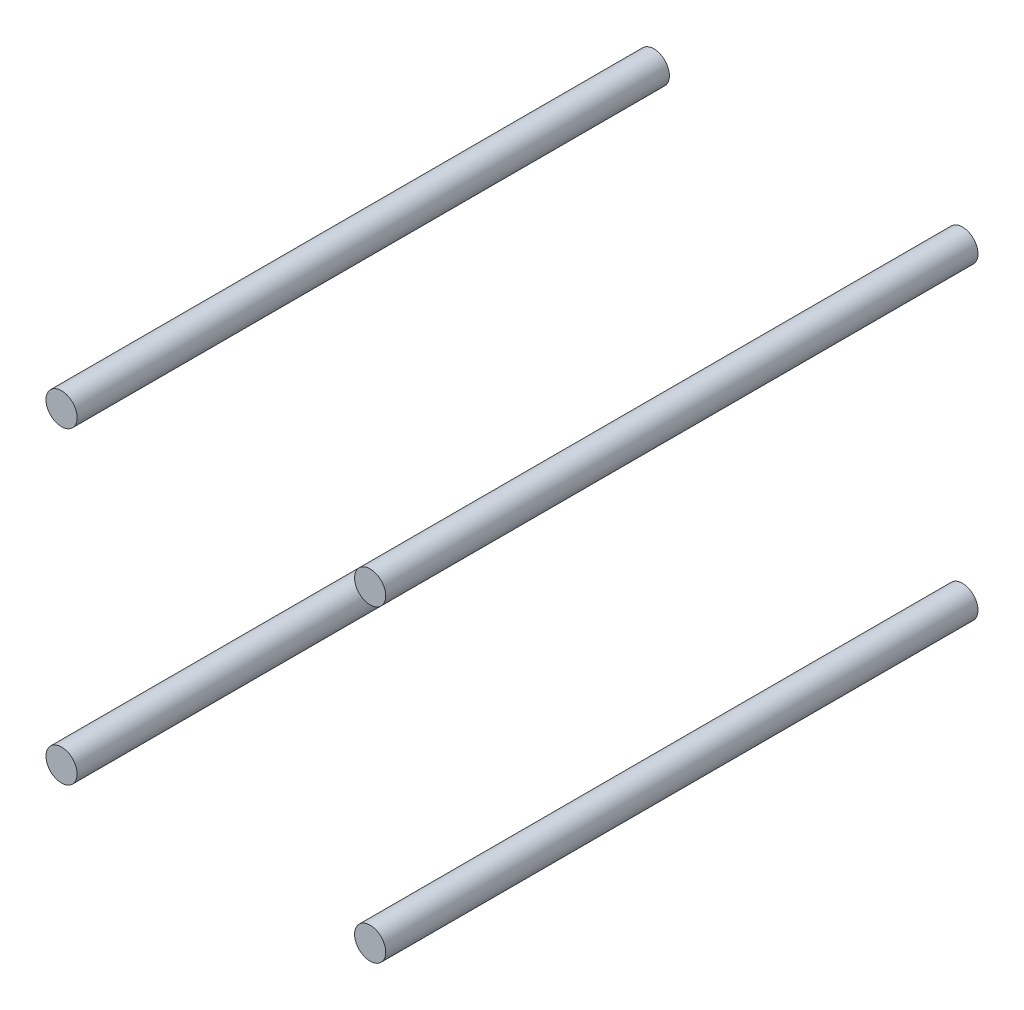
ISO-10303-21;
HEADER;
FILE_DESCRIPTION(('STEP AP214'),'2;1');
FILE_NAME('part.step','',(''),(''),'','','');
FILE_SCHEMA(('AUTOMOTIVE_DESIGN { 1 0 10303 214 1 1 1 1 }'));
ENDSEC;
DATA;
#1=APPLICATION_CONTEXT('core data for automotive mechanical design processes');
#2=APPLICATION_PROTOCOL_DEFINITION('international standard','automotive_design',2000,#1);
#3=PRODUCT_CONTEXT('',#1,'mechanical');
#4=PRODUCT('Part','Part','',(#3));
#5=PRODUCT_RELATED_PRODUCT_CATEGORY('part','',(#4));
#6=PRODUCT_DEFINITION_FORMATION('','',#4);
#7=PRODUCT_DEFINITION_CONTEXT('part definition',#1,'design');
#8=PRODUCT_DEFINITION('design','',#6,#7);
#9=PRODUCT_DEFINITION_SHAPE('','',#8);
#10=(LENGTH_UNIT() NAMED_UNIT(*) SI_UNIT(.MILLI.,.METRE.));
#11=(NAMED_UNIT(*) PLANE_ANGLE_UNIT() SI_UNIT($,.RADIAN.));
#12=(NAMED_UNIT(*) SI_UNIT($,.STERADIAN.) SOLID_ANGLE_UNIT());
#13=UNCERTAINTY_MEASURE_WITH_UNIT(LENGTH_MEASURE(1.E-05),#10,'distance_accuracy_value','');
#14=(GEOMETRIC_REPRESENTATION_CONTEXT(3) GLOBAL_UNCERTAINTY_ASSIGNED_CONTEXT((#13)) GLOBAL_UNIT_ASSIGNED_CONTEXT((#10,
#11,#12)) REPRESENTATION_CONTEXT('',''));
#15=CARTESIAN_POINT('',(0.,0.,0.));
#16=DIRECTION('',(0.,0.,1.));
#17=DIRECTION('',(1.,0.,0.));
#18=AXIS2_PLACEMENT_3D('',#15,#16,#17);
#19=CARTESIAN_POINT('',(24.7487373415292,-24.7487373415292,-95.));
#20=DIRECTION('',(0.,0.,1.));
#21=DIRECTION('',(1.,0.,0.));
#22=AXIS2_PLACEMENT_3D('',#19,#20,#21);
#23=CYLINDRICAL_SURFACE('',#22,2.49999999999999);
#24=CARTESIAN_POINT('',(24.7487373415292,-24.7487373415292,-95.));
#25=DIRECTION('',(0.,0.,1.));
#26=DIRECTION('',(1.,0.,0.));
#27=AXIS2_PLACEMENT_3D('',#24,#25,#26);
#28=CIRCLE('',#27,2.49999999999999);
#29=CARTESIAN_POINT('',(27.2487373415292,-24.7487373415292,-95.));
#30=VERTEX_POINT('',#29);
#31=EDGE_CURVE('E54',#30,#30,#28,.T.);
#32=ORIENTED_EDGE('',*,*,#31,.T.);
#33=EDGE_LOOP('',(#32));
#34=FACE_BOUND('',#33,.T.);
#35=CARTESIAN_POINT('',(24.7487373415292,-24.7487373415292,0.));
#36=DIRECTION('',(0.,0.,1.));
#37=DIRECTION('',(1.,0.,0.));
#38=AXIS2_PLACEMENT_3D('',#35,#36,#37);
#39=CIRCLE('',#38,2.49999999999999);
#40=CARTESIAN_POINT('',(27.2487373415292,-24.7487373415292,0.));
#41=VERTEX_POINT('',#40);
#42=EDGE_CURVE('E11',#41,#41,#39,.T.);
#43=ORIENTED_EDGE('',*,*,#42,.F.);
#44=EDGE_LOOP('',(#43));
#45=FACE_BOUND('',#44,.T.);
#46=ADVANCED_FACE('F50',(#34,#45),#23,.T.);
#47=CARTESIAN_POINT('',(24.7487373415292,-24.7487373415292,-95.));
#48=DIRECTION('',(0.,0.,1.));
#49=DIRECTION('',(1.,0.,0.));
#50=AXIS2_PLACEMENT_3D('',#47,#48,#49);
#51=PLANE('',#50);
#52=ORIENTED_EDGE('',*,*,#31,.F.);
#53=EDGE_LOOP('',(#52));
#54=FACE_BOUND('',#53,.T.);
#55=ADVANCED_FACE('F52',(#54),#51,.F.);
#56=CARTESIAN_POINT('',(24.7487373415292,-24.7487373415292,0.));
#57=DIRECTION('',(0.,0.,1.));
#58=DIRECTION('',(1.,0.,0.));
#59=AXIS2_PLACEMENT_3D('',#56,#57,#58);
#60=PLANE('',#59);
#61=ORIENTED_EDGE('',*,*,#42,.T.);
#62=EDGE_LOOP('',(#61));
#63=FACE_BOUND('',#62,.T.);
#64=ADVANCED_FACE('F66',(#63),#60,.T.);
#65=CLOSED_SHELL('',(#46,#55,#64));
#66=MANIFOLD_SOLID_BREP('B2',#65);
#67=CARTESIAN_POINT('',(-24.7487373415292,-24.7487373415292,-95.));
#68=DIRECTION('',(0.,0.,1.));
#69=DIRECTION('',(1.,0.,0.));
#70=AXIS2_PLACEMENT_3D('',#67,#68,#69);
#71=CYLINDRICAL_SURFACE('',#70,2.49999999999999);
#72=CARTESIAN_POINT('',(-24.7487373415292,-24.7487373415292,-95.));
#73=DIRECTION('',(0.,0.,1.));
#74=DIRECTION('',(1.,0.,0.));
#75=AXIS2_PLACEMENT_3D('',#72,#73,#74);
#76=CIRCLE('',#75,2.49999999999999);
#77=CARTESIAN_POINT('',(-22.2487373415292,-24.7487373415292,-95.));
#78=VERTEX_POINT('',#77);
#79=EDGE_CURVE('E109',#78,#78,#76,.T.);
#80=ORIENTED_EDGE('',*,*,#79,.T.);
#81=EDGE_LOOP('',(#80));
#82=FACE_BOUND('',#81,.T.);
#83=CARTESIAN_POINT('',(-24.7487373415292,-24.7487373415292,0.));
#84=DIRECTION('',(0.,0.,1.));
#85=DIRECTION('',(1.,0.,0.));
#86=AXIS2_PLACEMENT_3D('',#83,#84,#85);
#87=CIRCLE('',#86,2.49999999999999);
#88=CARTESIAN_POINT('',(-22.2487373415292,-24.7487373415292,0.));
#89=VERTEX_POINT('',#88);
#90=EDGE_CURVE('E49',#89,#89,#87,.T.);
#91=ORIENTED_EDGE('',*,*,#90,.F.);
#92=EDGE_LOOP('',(#91));
#93=FACE_BOUND('',#92,.T.);
#94=ADVANCED_FACE('F105',(#82,#93),#71,.T.);
#95=CARTESIAN_POINT('',(-24.7487373415292,-24.7487373415292,-95.));
#96=DIRECTION('',(0.,0.,1.));
#97=DIRECTION('',(1.,0.,0.));
#98=AXIS2_PLACEMENT_3D('',#95,#96,#97);
#99=PLANE('',#98);
#100=ORIENTED_EDGE('',*,*,#79,.F.);
#101=EDGE_LOOP('',(#100));
#102=FACE_BOUND('',#101,.T.);
#103=ADVANCED_FACE('F107',(#102),#99,.F.);
#104=CARTESIAN_POINT('',(-24.7487373415292,-24.7487373415292,0.));
#105=DIRECTION('',(0.,0.,1.));
#106=DIRECTION('',(1.,0.,0.));
#107=AXIS2_PLACEMENT_3D('',#104,#105,#106);
#108=PLANE('',#107);
#109=ORIENTED_EDGE('',*,*,#90,.T.);
#110=EDGE_LOOP('',(#109));
#111=FACE_BOUND('',#110,.T.);
#112=ADVANCED_FACE('F121',(#111),#108,.T.);
#113=CLOSED_SHELL('',(#94,#103,#112));
#114=MANIFOLD_SOLID_BREP('B6',#113);
#115=CARTESIAN_POINT('',(-24.7487373415292,24.7487373415292,-95.));
#116=DIRECTION('',(0.,0.,1.));
#117=DIRECTION('',(1.,0.,0.));
#118=AXIS2_PLACEMENT_3D('',#115,#116,#117);
#119=CYLINDRICAL_SURFACE('',#118,2.5);
#120=CARTESIAN_POINT('',(-24.7487373415292,24.7487373415292,-95.));
#121=DIRECTION('',(0.,0.,1.));
#122=DIRECTION('',(1.,0.,0.));
#123=AXIS2_PLACEMENT_3D('',#120,#121,#122);
#124=CIRCLE('',#123,2.5);
#125=CARTESIAN_POINT('',(-22.2487373415292,24.7487373415292,-95.));
#126=VERTEX_POINT('',#125);
#127=EDGE_CURVE('E163',#126,#126,#124,.T.);
#128=ORIENTED_EDGE('',*,*,#127,.T.);
#129=EDGE_LOOP('',(#128));
#130=FACE_BOUND('',#129,.T.);
#131=CARTESIAN_POINT('',(-24.7487373415292,24.7487373415292,0.));
#132=DIRECTION('',(0.,0.,1.));
#133=DIRECTION('',(1.,0.,0.));
#134=AXIS2_PLACEMENT_3D('',#131,#132,#133);
#135=CIRCLE('',#134,2.5);
#136=CARTESIAN_POINT('',(-22.2487373415292,24.7487373415292,0.));
#137=VERTEX_POINT('',#136);
#138=EDGE_CURVE('E104',#137,#137,#135,.T.);
#139=ORIENTED_EDGE('',*,*,#138,.F.);
#140=EDGE_LOOP('',(#139));
#141=FACE_BOUND('',#140,.T.);
#142=ADVANCED_FACE('F159',(#130,#141),#119,.T.);
#143=CARTESIAN_POINT('',(-24.7487373415292,24.7487373415292,-95.));
#144=DIRECTION('',(0.,0.,1.));
#145=DIRECTION('',(1.,0.,0.));
#146=AXIS2_PLACEMENT_3D('',#143,#144,#145);
#147=PLANE('',#146);
#148=ORIENTED_EDGE('',*,*,#127,.F.);
#149=EDGE_LOOP('',(#148));
#150=FACE_BOUND('',#149,.T.);
#151=ADVANCED_FACE('F161',(#150),#147,.F.);
#152=CARTESIAN_POINT('',(-24.7487373415292,24.7487373415292,0.));
#153=DIRECTION('',(0.,0.,1.));
#154=DIRECTION('',(1.,0.,0.));
#155=AXIS2_PLACEMENT_3D('',#152,#153,#154);
#156=PLANE('',#155);
#157=ORIENTED_EDGE('',*,*,#138,.T.);
#158=EDGE_LOOP('',(#157));
#159=FACE_BOUND('',#158,.T.);
#160=ADVANCED_FACE('F177',(#159),#156,.T.);
#161=CLOSED_SHELL('',(#142,#151,#160));
#162=MANIFOLD_SOLID_BREP('B44',#161);
#163=CARTESIAN_POINT('',(24.7487373415292,24.7487373415292,-95.));
#164=DIRECTION('',(0.,0.,1.));
#165=DIRECTION('',(1.,0.,0.));
#166=AXIS2_PLACEMENT_3D('',#163,#164,#165);
#167=CYLINDRICAL_SURFACE('',#166,2.5);
#168=CARTESIAN_POINT('',(24.7487373415292,24.7487373415292,-95.));
#169=DIRECTION('',(0.,0.,1.));
#170=DIRECTION('',(1.,0.,0.));
#171=AXIS2_PLACEMENT_3D('',#168,#169,#170);
#172=CIRCLE('',#171,2.5);
#173=CARTESIAN_POINT('',(27.2487373415292,24.7487373415292,-95.));
#174=VERTEX_POINT('',#173);
#175=EDGE_CURVE('E158',#174,#174,#172,.T.);
#176=ORIENTED_EDGE('',*,*,#175,.T.);
#177=EDGE_LOOP('',(#176));
#178=FACE_BOUND('',#177,.T.);
#179=CARTESIAN_POINT('',(24.7487373415292,24.7487373415292,0.));
#180=DIRECTION('',(0.,0.,1.));
#181=DIRECTION('',(1.,0.,0.));
#182=AXIS2_PLACEMENT_3D('',#179,#180,#181);
#183=CIRCLE('',#182,2.5);
#184=CARTESIAN_POINT('',(27.2487373415292,24.7487373415292,0.));
#185=VERTEX_POINT('',#184);
#186=EDGE_CURVE('E211',#185,#185,#183,.T.);
#187=ORIENTED_EDGE('',*,*,#186,.F.);
#188=EDGE_LOOP('',(#187));
#189=FACE_BOUND('',#188,.T.);
#190=ADVANCED_FACE('F208',(#178,#189),#167,.T.);
#191=CARTESIAN_POINT('',(24.7487373415292,24.7487373415292,-95.));
#192=DIRECTION('',(0.,0.,1.));
#193=DIRECTION('',(1.,0.,0.));
#194=AXIS2_PLACEMENT_3D('',#191,#192,#193);
#195=PLANE('',#194);
#196=ORIENTED_EDGE('',*,*,#175,.F.);
#197=EDGE_LOOP('',(#196));
#198=FACE_BOUND('',#197,.T.);
#199=ADVANCED_FACE('F223',(#198),#195,.F.);
#200=CARTESIAN_POINT('',(24.7487373415292,24.7487373415292,0.));
#201=DIRECTION('',(0.,0.,1.));
#202=DIRECTION('',(1.,0.,0.));
#203=AXIS2_PLACEMENT_3D('',#200,#201,#202);
#204=PLANE('',#203);
#205=ORIENTED_EDGE('',*,*,#186,.T.);
#206=EDGE_LOOP('',(#205));
#207=FACE_BOUND('',#206,.T.);
#208=ADVANCED_FACE('F220',(#207),#204,.T.);
#209=CLOSED_SHELL('',(#190,#199,#208));
#210=MANIFOLD_SOLID_BREP('B99',#209);
#211=ADVANCED_BREP_SHAPE_REPRESENTATION('',(#18,#66,#114,#162,#210),#14);
#212=SHAPE_DEFINITION_REPRESENTATION(#9,#211);
ENDSEC;
END-ISO-10303-21;
